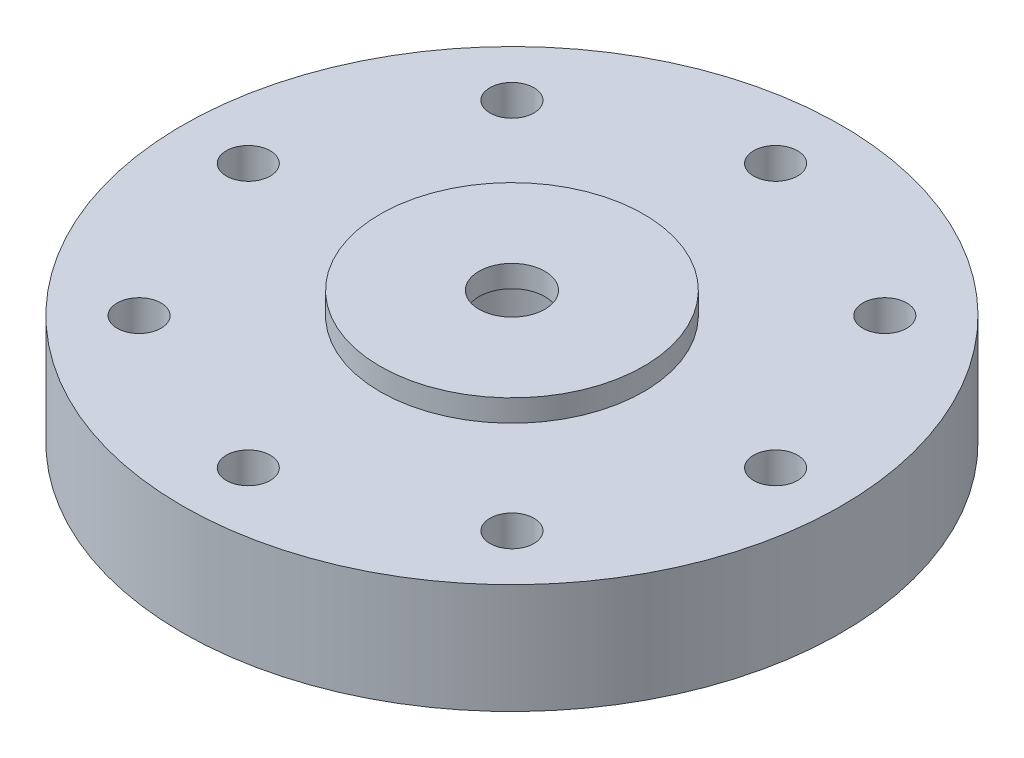
ISO-10303-21;
HEADER;
FILE_DESCRIPTION(('STEP AP214'),'2;1');
FILE_NAME('part.step','',(''),(''),'','','');
FILE_SCHEMA(('AUTOMOTIVE_DESIGN { 1 0 10303 214 1 1 1 1 }'));
ENDSEC;
DATA;
#1=APPLICATION_CONTEXT('core data for automotive mechanical design processes');
#2=APPLICATION_PROTOCOL_DEFINITION('international standard','automotive_design',2000,#1);
#3=PRODUCT_CONTEXT('',#1,'mechanical');
#4=PRODUCT('Part','Part','',(#3));
#5=PRODUCT_RELATED_PRODUCT_CATEGORY('part','',(#4));
#6=PRODUCT_DEFINITION_FORMATION('','',#4);
#7=PRODUCT_DEFINITION_CONTEXT('part definition',#1,'design');
#8=PRODUCT_DEFINITION('design','',#6,#7);
#9=PRODUCT_DEFINITION_SHAPE('','',#8);
#10=(LENGTH_UNIT() NAMED_UNIT(*) SI_UNIT(.MILLI.,.METRE.));
#11=(NAMED_UNIT(*) PLANE_ANGLE_UNIT() SI_UNIT($,.RADIAN.));
#12=(NAMED_UNIT(*) SI_UNIT($,.STERADIAN.) SOLID_ANGLE_UNIT());
#13=UNCERTAINTY_MEASURE_WITH_UNIT(LENGTH_MEASURE(1.E-05),#10,'distance_accuracy_value','');
#14=(GEOMETRIC_REPRESENTATION_CONTEXT(3) GLOBAL_UNCERTAINTY_ASSIGNED_CONTEXT((#13)) GLOBAL_UNIT_ASSIGNED_CONTEXT((#10,
#11,#12)) REPRESENTATION_CONTEXT('',''));
#15=CARTESIAN_POINT('',(0.,0.,0.));
#16=DIRECTION('',(0.,0.,1.));
#17=DIRECTION('',(1.,0.,0.));
#18=AXIS2_PLACEMENT_3D('',#15,#16,#17);
#19=CARTESIAN_POINT('',(0.,5.,0.));
#20=DIRECTION('',(0.,1.,0.));
#21=DIRECTION('',(0.,0.,1.));
#22=AXIS2_PLACEMENT_3D('',#19,#20,#21);
#23=PLANE('',#22);
#24=CARTESIAN_POINT('',(0.,5.,0.));
#25=DIRECTION('',(0.,1.,0.));
#26=DIRECTION('',(0.,0.,1.));
#27=AXIS2_PLACEMENT_3D('',#24,#25,#26);
#28=CIRCLE('',#27,6.);
#29=CARTESIAN_POINT('',(0.,5.,6.));
#30=VERTEX_POINT('',#29);
#31=EDGE_CURVE('E102',#30,#30,#28,.T.);
#32=ORIENTED_EDGE('',*,*,#31,.F.);
#33=EDGE_LOOP('',(#32));
#34=FACE_BOUND('',#33,.T.);
#35=CARTESIAN_POINT('',(-11.9999999999994,5.,6.24638080090347E-13));
#36=DIRECTION('',(0.,1.,0.));
#37=DIRECTION('',(0.,0.,1.));
#38=AXIS2_PLACEMENT_3D('',#35,#36,#37);
#39=CIRCLE('',#38,1.00000000000085);
#40=CARTESIAN_POINT('',(-11.9999999999994,5.,1.00000000000148));
#41=VERTEX_POINT('',#40);
#42=EDGE_CURVE('E87',#41,#41,#39,.T.);
#43=ORIENTED_EDGE('',*,*,#42,.F.);
#44=EDGE_LOOP('',(#43));
#45=FACE_BOUND('',#44,.T.);
#46=CARTESIAN_POINT('',(1.24613109427259E-12,5.,12.));
#47=DIRECTION('',(0.,1.,0.));
#48=DIRECTION('',(0.,0.,1.));
#49=AXIS2_PLACEMENT_3D('',#46,#47,#48);
#50=CIRCLE('',#49,1.00000000000085);
#51=CARTESIAN_POINT('',(1.24613109427259E-12,5.,13.0000000000009));
#52=VERTEX_POINT('',#51);
#53=EDGE_CURVE('E75',#52,#52,#50,.T.);
#54=ORIENTED_EDGE('',*,*,#53,.F.);
#55=EDGE_LOOP('',(#54));
#56=FACE_BOUND('',#55,.T.);
#57=CARTESIAN_POINT('',(12.0000000000006,5.,-6.23168503931371E-13));
#58=DIRECTION('',(0.,1.,0.));
#59=DIRECTION('',(0.,0.,1.));
#60=AXIS2_PLACEMENT_3D('',#57,#58,#59);
#61=CIRCLE('',#60,1.00000000000085);
#62=CARTESIAN_POINT('',(12.0000000000006,5.,1.00000000000023));
#63=VERTEX_POINT('',#62);
#64=EDGE_CURVE('E63',#63,#63,#61,.T.);
#65=ORIENTED_EDGE('',*,*,#64,.F.);
#66=EDGE_LOOP('',(#65));
#67=FACE_BOUND('',#66,.T.);
#68=CARTESIAN_POINT('',(0.,5.,-12.));
#69=DIRECTION('',(0.,1.,0.));
#70=DIRECTION('',(0.,0.,1.));
#71=AXIS2_PLACEMENT_3D('',#68,#69,#70);
#72=CIRCLE('',#71,1.00000000000085);
#73=CARTESIAN_POINT('',(0.,5.,-10.9999999999991));
#74=VERTEX_POINT('',#73);
#75=EDGE_CURVE('E52',#74,#74,#72,.T.);
#76=ORIENTED_EDGE('',*,*,#75,.F.);
#77=EDGE_LOOP('',(#76));
#78=FACE_BOUND('',#77,.T.);
#79=CARTESIAN_POINT('',(0.,5.,0.));
#80=DIRECTION('',(0.,1.,0.));
#81=DIRECTION('',(0.,0.,1.));
#82=AXIS2_PLACEMENT_3D('',#79,#80,#81);
#83=CIRCLE('',#82,15.);
#84=CARTESIAN_POINT('',(0.,5.,15.));
#85=VERTEX_POINT('',#84);
#86=EDGE_CURVE('E10',#85,#85,#83,.T.);
#87=ORIENTED_EDGE('',*,*,#86,.T.);
#88=EDGE_LOOP('',(#87));
#89=FACE_BOUND('',#88,.T.);
#90=CARTESIAN_POINT('',(8.48528137423875,5.,-8.48528137423901));
#91=DIRECTION('',(0.,1.,0.));
#92=DIRECTION('',(0.,0.,1.));
#93=AXIS2_PLACEMENT_3D('',#90,#91,#92);
#94=CIRCLE('',#93,1.00000000000085);
#95=CARTESIAN_POINT('',(8.48528137423875,5.,-7.48528137423816));
#96=VERTEX_POINT('',#95);
#97=EDGE_CURVE('E57',#96,#96,#94,.T.);
#98=ORIENTED_EDGE('',*,*,#97,.F.);
#99=EDGE_LOOP('',(#98));
#100=FACE_BOUND('',#99,.T.);
#101=CARTESIAN_POINT('',(8.48528137423963,5.,8.48528137423813));
#102=DIRECTION('',(0.,1.,0.));
#103=DIRECTION('',(0.,0.,1.));
#104=AXIS2_PLACEMENT_3D('',#101,#102,#103);
#105=CIRCLE('',#104,1.00000000000085);
#106=CARTESIAN_POINT('',(8.48528137423963,5.,9.48528137423898));
#107=VERTEX_POINT('',#106);
#108=EDGE_CURVE('E69',#107,#107,#105,.T.);
#109=ORIENTED_EDGE('',*,*,#108,.F.);
#110=EDGE_LOOP('',(#109));
#111=FACE_BOUND('',#110,.T.);
#112=CARTESIAN_POINT('',(-8.48528137423751,5.,8.48528137423901));
#113=DIRECTION('',(0.,1.,0.));
#114=DIRECTION('',(0.,0.,1.));
#115=AXIS2_PLACEMENT_3D('',#112,#113,#114);
#116=CIRCLE('',#115,1.00000000000085);
#117=CARTESIAN_POINT('',(-8.48528137423751,5.,9.48528137423986));
#118=VERTEX_POINT('',#117);
#119=EDGE_CURVE('E81',#118,#118,#116,.T.);
#120=ORIENTED_EDGE('',*,*,#119,.F.);
#121=EDGE_LOOP('',(#120));
#122=FACE_BOUND('',#121,.T.);
#123=CARTESIAN_POINT('',(-8.48528137423839,5.,-8.48528137423813));
#124=DIRECTION('',(0.,1.,0.));
#125=DIRECTION('',(0.,0.,1.));
#126=AXIS2_PLACEMENT_3D('',#123,#124,#125);
#127=CIRCLE('',#126,1.00000000000085);
#128=CARTESIAN_POINT('',(-8.48528137423839,5.,-7.48528137423728));
#129=VERTEX_POINT('',#128);
#130=EDGE_CURVE('E93',#129,#129,#127,.T.);
#131=ORIENTED_EDGE('',*,*,#130,.F.);
#132=EDGE_LOOP('',(#131));
#133=FACE_BOUND('',#132,.T.);
#134=ADVANCED_FACE('F39',(#34,#45,#56,#67,#78,#89,#100,#111,#122,#133),#23,.T.);
#135=CARTESIAN_POINT('',(0.,0.,0.));
#136=DIRECTION('',(0.,1.,0.));
#137=DIRECTION('',(0.,0.,1.));
#138=AXIS2_PLACEMENT_3D('',#135,#136,#137);
#139=PLANE('',#138);
#140=CARTESIAN_POINT('',(0.,0.,0.));
#141=DIRECTION('',(0.,-1.,0.));
#142=DIRECTION('',(0.,0.,-1.));
#143=AXIS2_PLACEMENT_3D('',#140,#141,#142);
#144=CIRCLE('',#143,3.);
#145=CARTESIAN_POINT('',(0.,0.,-3.));
#146=VERTEX_POINT('',#145);
#147=EDGE_CURVE('E108',#146,#146,#144,.T.);
#148=ORIENTED_EDGE('',*,*,#147,.F.);
#149=EDGE_LOOP('',(#148));
#150=FACE_BOUND('',#149,.T.);
#151=CARTESIAN_POINT('',(0.,0.,0.));
#152=DIRECTION('',(0.,1.,0.));
#153=DIRECTION('',(0.,0.,1.));
#154=AXIS2_PLACEMENT_3D('',#151,#152,#153);
#155=CIRCLE('',#154,15.);
#156=CARTESIAN_POINT('',(0.,0.,15.));
#157=VERTEX_POINT('',#156);
#158=EDGE_CURVE('E47',#157,#157,#155,.T.);
#159=ORIENTED_EDGE('',*,*,#158,.F.);
#160=EDGE_LOOP('',(#159));
#161=FACE_BOUND('',#160,.T.);
#162=CARTESIAN_POINT('',(0.,0.,-12.));
#163=DIRECTION('',(0.,1.,0.));
#164=DIRECTION('',(0.,0.,1.));
#165=AXIS2_PLACEMENT_3D('',#162,#163,#164);
#166=CIRCLE('',#165,1.00000000000085);
#167=CARTESIAN_POINT('',(0.,0.,-10.9999999999991));
#168=VERTEX_POINT('',#167);
#169=EDGE_CURVE('E54',#168,#168,#166,.T.);
#170=ORIENTED_EDGE('',*,*,#169,.T.);
#171=EDGE_LOOP('',(#170));
#172=FACE_BOUND('',#171,.T.);
#173=CARTESIAN_POINT('',(8.48528137423875,0.,-8.48528137423901));
#174=DIRECTION('',(0.,1.,0.));
#175=DIRECTION('',(0.,0.,1.));
#176=AXIS2_PLACEMENT_3D('',#173,#174,#175);
#177=CIRCLE('',#176,1.00000000000085);
#178=CARTESIAN_POINT('',(8.48528137423875,0.,-7.48528137423816));
#179=VERTEX_POINT('',#178);
#180=EDGE_CURVE('E60',#179,#179,#177,.T.);
#181=ORIENTED_EDGE('',*,*,#180,.T.);
#182=EDGE_LOOP('',(#181));
#183=FACE_BOUND('',#182,.T.);
#184=CARTESIAN_POINT('',(12.0000000000006,0.,-6.23168503931371E-13));
#185=DIRECTION('',(0.,1.,0.));
#186=DIRECTION('',(0.,0.,1.));
#187=AXIS2_PLACEMENT_3D('',#184,#185,#186);
#188=CIRCLE('',#187,1.00000000000085);
#189=CARTESIAN_POINT('',(12.0000000000006,0.,1.00000000000023));
#190=VERTEX_POINT('',#189);
#191=EDGE_CURVE('E66',#190,#190,#188,.T.);
#192=ORIENTED_EDGE('',*,*,#191,.T.);
#193=EDGE_LOOP('',(#192));
#194=FACE_BOUND('',#193,.T.);
#195=CARTESIAN_POINT('',(8.48528137423963,0.,8.48528137423813));
#196=DIRECTION('',(0.,1.,0.));
#197=DIRECTION('',(0.,0.,1.));
#198=AXIS2_PLACEMENT_3D('',#195,#196,#197);
#199=CIRCLE('',#198,1.00000000000085);
#200=CARTESIAN_POINT('',(8.48528137423963,0.,9.48528137423898));
#201=VERTEX_POINT('',#200);
#202=EDGE_CURVE('E72',#201,#201,#199,.T.);
#203=ORIENTED_EDGE('',*,*,#202,.T.);
#204=EDGE_LOOP('',(#203));
#205=FACE_BOUND('',#204,.T.);
#206=CARTESIAN_POINT('',(1.24613109427259E-12,0.,12.));
#207=DIRECTION('',(0.,1.,0.));
#208=DIRECTION('',(0.,0.,1.));
#209=AXIS2_PLACEMENT_3D('',#206,#207,#208);
#210=CIRCLE('',#209,1.00000000000085);
#211=CARTESIAN_POINT('',(1.24613109427259E-12,0.,13.0000000000009));
#212=VERTEX_POINT('',#211);
#213=EDGE_CURVE('E78',#212,#212,#210,.T.);
#214=ORIENTED_EDGE('',*,*,#213,.T.);
#215=EDGE_LOOP('',(#214));
#216=FACE_BOUND('',#215,.T.);
#217=CARTESIAN_POINT('',(-8.48528137423751,0.,8.48528137423901));
#218=DIRECTION('',(0.,1.,0.));
#219=DIRECTION('',(0.,0.,1.));
#220=AXIS2_PLACEMENT_3D('',#217,#218,#219);
#221=CIRCLE('',#220,1.00000000000085);
#222=CARTESIAN_POINT('',(-8.48528137423751,0.,9.48528137423986));
#223=VERTEX_POINT('',#222);
#224=EDGE_CURVE('E84',#223,#223,#221,.T.);
#225=ORIENTED_EDGE('',*,*,#224,.T.);
#226=EDGE_LOOP('',(#225));
#227=FACE_BOUND('',#226,.T.);
#228=CARTESIAN_POINT('',(-11.9999999999994,0.,6.24638080090347E-13));
#229=DIRECTION('',(0.,1.,0.));
#230=DIRECTION('',(0.,0.,1.));
#231=AXIS2_PLACEMENT_3D('',#228,#229,#230);
#232=CIRCLE('',#231,1.00000000000085);
#233=CARTESIAN_POINT('',(-11.9999999999994,0.,1.00000000000148));
#234=VERTEX_POINT('',#233);
#235=EDGE_CURVE('E90',#234,#234,#232,.T.);
#236=ORIENTED_EDGE('',*,*,#235,.T.);
#237=EDGE_LOOP('',(#236));
#238=FACE_BOUND('',#237,.T.);
#239=CARTESIAN_POINT('',(-8.48528137423839,0.,-8.48528137423813));
#240=DIRECTION('',(0.,1.,0.));
#241=DIRECTION('',(0.,0.,1.));
#242=AXIS2_PLACEMENT_3D('',#239,#240,#241);
#243=CIRCLE('',#242,1.00000000000085);
#244=CARTESIAN_POINT('',(-8.48528137423839,0.,-7.48528137423728));
#245=VERTEX_POINT('',#244);
#246=EDGE_CURVE('E96',#245,#245,#243,.T.);
#247=ORIENTED_EDGE('',*,*,#246,.T.);
#248=EDGE_LOOP('',(#247));
#249=FACE_BOUND('',#248,.T.);
#250=ADVANCED_FACE('F135',(#150,#161,#172,#183,#194,#205,#216,#227,#238,#249),#139,.F.);
#251=CARTESIAN_POINT('',(0.,5.,0.));
#252=DIRECTION('',(0.,-1.,0.));
#253=DIRECTION('',(0.,0.,-1.));
#254=AXIS2_PLACEMENT_3D('',#251,#252,#253);
#255=CYLINDRICAL_SURFACE('',#254,15.);
#256=ORIENTED_EDGE('',*,*,#86,.F.);
#257=EDGE_LOOP('',(#256));
#258=FACE_BOUND('',#257,.T.);
#259=ORIENTED_EDGE('',*,*,#158,.T.);
#260=EDGE_LOOP('',(#259));
#261=FACE_BOUND('',#260,.T.);
#262=ADVANCED_FACE('F41',(#258,#261),#255,.T.);
#263=CARTESIAN_POINT('',(0.,5.,-12.));
#264=DIRECTION('',(0.,-1.,0.));
#265=DIRECTION('',(0.,0.,-1.));
#266=AXIS2_PLACEMENT_3D('',#263,#264,#265);
#267=CYLINDRICAL_SURFACE('',#266,1.00000000000085);
#268=ORIENTED_EDGE('',*,*,#75,.T.);
#269=EDGE_LOOP('',(#268));
#270=FACE_BOUND('',#269,.T.);
#271=ORIENTED_EDGE('',*,*,#169,.F.);
#272=EDGE_LOOP('',(#271));
#273=FACE_BOUND('',#272,.T.);
#274=ADVANCED_FACE('F179',(#270,#273),#267,.F.);
#275=CARTESIAN_POINT('',(8.48528137423875,5.,-8.48528137423901));
#276=DIRECTION('',(0.,-1.,0.));
#277=DIRECTION('',(0.,0.,-1.));
#278=AXIS2_PLACEMENT_3D('',#275,#276,#277);
#279=CYLINDRICAL_SURFACE('',#278,1.00000000000085);
#280=ORIENTED_EDGE('',*,*,#97,.T.);
#281=EDGE_LOOP('',(#280));
#282=FACE_BOUND('',#281,.T.);
#283=ORIENTED_EDGE('',*,*,#180,.F.);
#284=EDGE_LOOP('',(#283));
#285=FACE_BOUND('',#284,.T.);
#286=ADVANCED_FACE('F182',(#282,#285),#279,.F.);
#287=CARTESIAN_POINT('',(12.0000000000006,5.,-6.23168503931371E-13));
#288=DIRECTION('',(0.,-1.,0.));
#289=DIRECTION('',(0.,0.,-1.));
#290=AXIS2_PLACEMENT_3D('',#287,#288,#289);
#291=CYLINDRICAL_SURFACE('',#290,1.00000000000085);
#292=ORIENTED_EDGE('',*,*,#64,.T.);
#293=EDGE_LOOP('',(#292));
#294=FACE_BOUND('',#293,.T.);
#295=ORIENTED_EDGE('',*,*,#191,.F.);
#296=EDGE_LOOP('',(#295));
#297=FACE_BOUND('',#296,.T.);
#298=ADVANCED_FACE('F186',(#294,#297),#291,.F.);
#299=CARTESIAN_POINT('',(8.48528137423963,5.,8.48528137423813));
#300=DIRECTION('',(0.,-1.,0.));
#301=DIRECTION('',(0.,0.,-1.));
#302=AXIS2_PLACEMENT_3D('',#299,#300,#301);
#303=CYLINDRICAL_SURFACE('',#302,1.00000000000085);
#304=ORIENTED_EDGE('',*,*,#108,.T.);
#305=EDGE_LOOP('',(#304));
#306=FACE_BOUND('',#305,.T.);
#307=ORIENTED_EDGE('',*,*,#202,.F.);
#308=EDGE_LOOP('',(#307));
#309=FACE_BOUND('',#308,.T.);
#310=ADVANCED_FACE('F190',(#306,#309),#303,.F.);
#311=CARTESIAN_POINT('',(1.24613109427259E-12,5.,12.));
#312=DIRECTION('',(0.,-1.,0.));
#313=DIRECTION('',(0.,0.,-1.));
#314=AXIS2_PLACEMENT_3D('',#311,#312,#313);
#315=CYLINDRICAL_SURFACE('',#314,1.00000000000085);
#316=ORIENTED_EDGE('',*,*,#53,.T.);
#317=EDGE_LOOP('',(#316));
#318=FACE_BOUND('',#317,.T.);
#319=ORIENTED_EDGE('',*,*,#213,.F.);
#320=EDGE_LOOP('',(#319));
#321=FACE_BOUND('',#320,.T.);
#322=ADVANCED_FACE('F194',(#318,#321),#315,.F.);
#323=CARTESIAN_POINT('',(-8.48528137423751,5.,8.48528137423901));
#324=DIRECTION('',(0.,-1.,0.));
#325=DIRECTION('',(0.,0.,-1.));
#326=AXIS2_PLACEMENT_3D('',#323,#324,#325);
#327=CYLINDRICAL_SURFACE('',#326,1.00000000000085);
#328=ORIENTED_EDGE('',*,*,#119,.T.);
#329=EDGE_LOOP('',(#328));
#330=FACE_BOUND('',#329,.T.);
#331=ORIENTED_EDGE('',*,*,#224,.F.);
#332=EDGE_LOOP('',(#331));
#333=FACE_BOUND('',#332,.T.);
#334=ADVANCED_FACE('F169',(#330,#333),#327,.F.);
#335=CARTESIAN_POINT('',(-11.9999999999994,5.,6.24638080090347E-13));
#336=DIRECTION('',(0.,-1.,0.));
#337=DIRECTION('',(0.,0.,-1.));
#338=AXIS2_PLACEMENT_3D('',#335,#336,#337);
#339=CYLINDRICAL_SURFACE('',#338,1.00000000000085);
#340=ORIENTED_EDGE('',*,*,#42,.T.);
#341=EDGE_LOOP('',(#340));
#342=FACE_BOUND('',#341,.T.);
#343=ORIENTED_EDGE('',*,*,#235,.F.);
#344=EDGE_LOOP('',(#343));
#345=FACE_BOUND('',#344,.T.);
#346=ADVANCED_FACE('F159',(#342,#345),#339,.F.);
#347=CARTESIAN_POINT('',(-8.48528137423839,5.,-8.48528137423813));
#348=DIRECTION('',(0.,-1.,0.));
#349=DIRECTION('',(0.,0.,-1.));
#350=AXIS2_PLACEMENT_3D('',#347,#348,#349);
#351=CYLINDRICAL_SURFACE('',#350,1.00000000000085);
#352=ORIENTED_EDGE('',*,*,#130,.T.);
#353=EDGE_LOOP('',(#352));
#354=FACE_BOUND('',#353,.T.);
#355=ORIENTED_EDGE('',*,*,#246,.F.);
#356=EDGE_LOOP('',(#355));
#357=FACE_BOUND('',#356,.T.);
#358=ADVANCED_FACE('F156',(#354,#357),#351,.F.);
#359=CARTESIAN_POINT('',(0.,6.,0.));
#360=DIRECTION('',(0.,-1.,0.));
#361=DIRECTION('',(0.,0.,-1.));
#362=AXIS2_PLACEMENT_3D('',#359,#360,#361);
#363=CYLINDRICAL_SURFACE('',#362,6.);
#364=CARTESIAN_POINT('',(0.,6.,0.));
#365=DIRECTION('',(0.,1.,0.));
#366=DIRECTION('',(0.,0.,1.));
#367=AXIS2_PLACEMENT_3D('',#364,#365,#366);
#368=CIRCLE('',#367,6.);
#369=CARTESIAN_POINT('',(0.,6.,6.));
#370=VERTEX_POINT('',#369);
#371=EDGE_CURVE('E99',#370,#370,#368,.T.);
#372=ORIENTED_EDGE('',*,*,#371,.F.);
#373=EDGE_LOOP('',(#372));
#374=FACE_BOUND('',#373,.T.);
#375=ORIENTED_EDGE('',*,*,#31,.T.);
#376=EDGE_LOOP('',(#375));
#377=FACE_BOUND('',#376,.T.);
#378=ADVANCED_FACE('F158',(#374,#377),#363,.T.);
#379=CARTESIAN_POINT('',(0.,6.,0.));
#380=DIRECTION('',(0.,1.,0.));
#381=DIRECTION('',(0.,0.,1.));
#382=AXIS2_PLACEMENT_3D('',#379,#380,#381);
#383=PLANE('',#382);
#384=CARTESIAN_POINT('',(0.,6.,0.));
#385=DIRECTION('',(0.,1.,0.));
#386=DIRECTION('',(0.,0.,1.));
#387=AXIS2_PLACEMENT_3D('',#384,#385,#386);
#388=CIRCLE('',#387,1.5);
#389=CARTESIAN_POINT('',(0.,6.,1.5));
#390=VERTEX_POINT('',#389);
#391=EDGE_CURVE('E113',#390,#390,#388,.T.);
#392=ORIENTED_EDGE('',*,*,#391,.F.);
#393=EDGE_LOOP('',(#392));
#394=FACE_BOUND('',#393,.T.);
#395=ORIENTED_EDGE('',*,*,#371,.T.);
#396=EDGE_LOOP('',(#395));
#397=FACE_BOUND('',#396,.T.);
#398=ADVANCED_FACE('F131',(#394,#397),#383,.T.);
#399=CARTESIAN_POINT('',(0.,5.,0.));
#400=DIRECTION('',(0.,-1.,0.));
#401=DIRECTION('',(0.,0.,-1.));
#402=AXIS2_PLACEMENT_3D('',#399,#400,#401);
#403=CYLINDRICAL_SURFACE('',#402,3.);
#404=CARTESIAN_POINT('',(0.,5.,0.));
#405=DIRECTION('',(0.,-1.,0.));
#406=DIRECTION('',(0.,0.,-1.));
#407=AXIS2_PLACEMENT_3D('',#404,#405,#406);
#408=CIRCLE('',#407,3.);
#409=CARTESIAN_POINT('',(0.,5.,-3.));
#410=VERTEX_POINT('',#409);
#411=EDGE_CURVE('E105',#410,#410,#408,.T.);
#412=ORIENTED_EDGE('',*,*,#411,.F.);
#413=EDGE_LOOP('',(#412));
#414=FACE_BOUND('',#413,.T.);
#415=ORIENTED_EDGE('',*,*,#147,.T.);
#416=EDGE_LOOP('',(#415));
#417=FACE_BOUND('',#416,.T.);
#418=ADVANCED_FACE('F125',(#414,#417),#403,.F.);
#419=CARTESIAN_POINT('',(0.,5.,0.));
#420=DIRECTION('',(0.,-1.,0.));
#421=DIRECTION('',(0.,0.,-1.));
#422=AXIS2_PLACEMENT_3D('',#419,#420,#421);
#423=PLANE('',#422);
#424=CARTESIAN_POINT('',(0.,5.,0.));
#425=DIRECTION('',(0.,-1.,0.));
#426=DIRECTION('',(0.,0.,-1.));
#427=AXIS2_PLACEMENT_3D('',#424,#425,#426);
#428=CIRCLE('',#427,1.5);
#429=CARTESIAN_POINT('',(0.,5.,-1.5));
#430=VERTEX_POINT('',#429);
#431=EDGE_CURVE('E43',#430,#430,#428,.T.);
#432=ORIENTED_EDGE('',*,*,#431,.F.);
#433=EDGE_LOOP('',(#432));
#434=FACE_BOUND('',#433,.T.);
#435=ORIENTED_EDGE('',*,*,#411,.T.);
#436=EDGE_LOOP('',(#435));
#437=FACE_BOUND('',#436,.T.);
#438=ADVANCED_FACE('F122',(#434,#437),#423,.T.);
#439=CARTESIAN_POINT('',(0.,1.,0.));
#440=DIRECTION('',(0.,1.,0.));
#441=DIRECTION('',(0.,0.,1.));
#442=AXIS2_PLACEMENT_3D('',#439,#440,#441);
#443=CYLINDRICAL_SURFACE('',#442,1.5);
#444=ORIENTED_EDGE('',*,*,#431,.T.);
#445=EDGE_LOOP('',(#444));
#446=FACE_BOUND('',#445,.T.);
#447=ORIENTED_EDGE('',*,*,#391,.T.);
#448=EDGE_LOOP('',(#447));
#449=FACE_BOUND('',#448,.T.);
#450=ADVANCED_FACE('F120',(#446,#449),#443,.F.);
#451=CLOSED_SHELL('',(#134,#250,#262,#274,#286,#298,#310,#322,#334,#346,#358,#378,#398,#418,
#438,#450));
#452=MANIFOLD_SOLID_BREP('B2',#451);
#453=ADVANCED_BREP_SHAPE_REPRESENTATION('',(#18,#452),#14);
#454=SHAPE_DEFINITION_REPRESENTATION(#9,#453);
ENDSEC;
END-ISO-10303-21;
